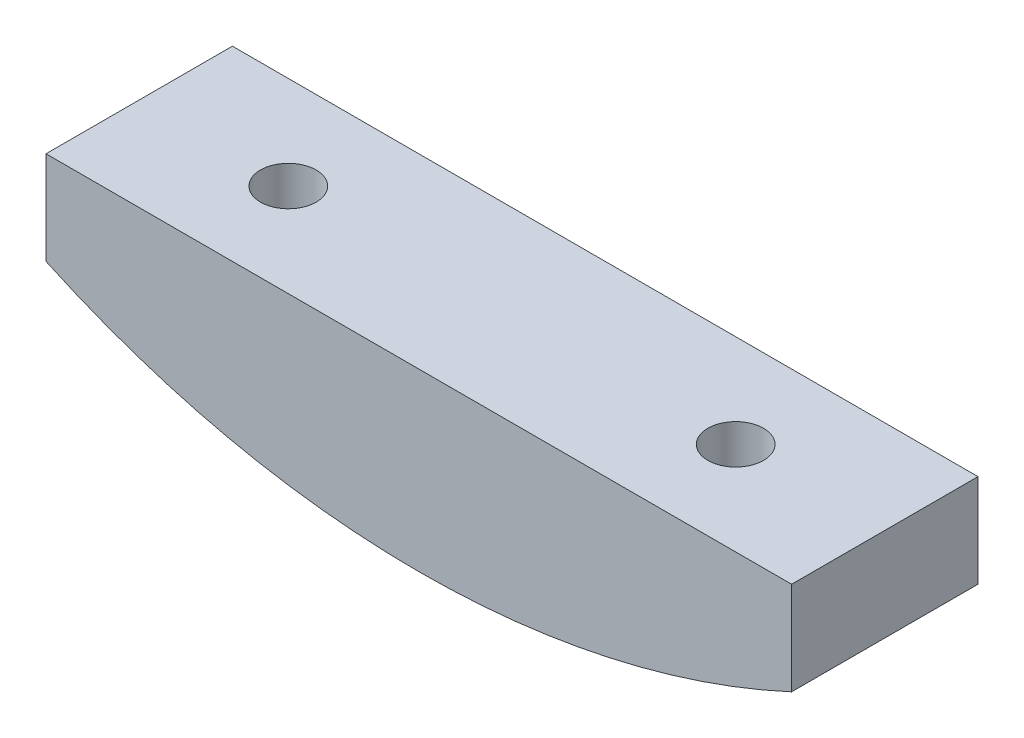
ISO-10303-21;
HEADER;
FILE_DESCRIPTION(('STEP AP214'),'2;1');
FILE_NAME('part.step','',(''),(''),'','','');
FILE_SCHEMA(('AUTOMOTIVE_DESIGN { 1 0 10303 214 1 1 1 1 }'));
ENDSEC;
DATA;
#1=APPLICATION_CONTEXT('core data for automotive mechanical design processes');
#2=APPLICATION_PROTOCOL_DEFINITION('international standard','automotive_design',2000,#1);
#3=PRODUCT_CONTEXT('',#1,'mechanical');
#4=PRODUCT('Part','Part','',(#3));
#5=PRODUCT_RELATED_PRODUCT_CATEGORY('part','',(#4));
#6=PRODUCT_DEFINITION_FORMATION('','',#4);
#7=PRODUCT_DEFINITION_CONTEXT('part definition',#1,'design');
#8=PRODUCT_DEFINITION('design','',#6,#7);
#9=PRODUCT_DEFINITION_SHAPE('','',#8);
#10=(LENGTH_UNIT() NAMED_UNIT(*) SI_UNIT(.MILLI.,.METRE.));
#11=(NAMED_UNIT(*) PLANE_ANGLE_UNIT() SI_UNIT($,.RADIAN.));
#12=(NAMED_UNIT(*) SI_UNIT($,.STERADIAN.) SOLID_ANGLE_UNIT());
#13=UNCERTAINTY_MEASURE_WITH_UNIT(LENGTH_MEASURE(1.E-05),#10,'distance_accuracy_value','');
#14=(GEOMETRIC_REPRESENTATION_CONTEXT(3) GLOBAL_UNCERTAINTY_ASSIGNED_CONTEXT((#13)) GLOBAL_UNIT_ASSIGNED_CONTEXT((#10,
#11,#12)) REPRESENTATION_CONTEXT('',''));
#15=CARTESIAN_POINT('',(0.,0.,0.));
#16=DIRECTION('',(0.,0.,1.));
#17=DIRECTION('',(1.,0.,0.));
#18=AXIS2_PLACEMENT_3D('',#15,#16,#17);
#19=CARTESIAN_POINT('',(25.4,6.35,22.225));
#20=DIRECTION('',(-1.,0.,0.));
#21=DIRECTION('',(0.,0.,1.));
#22=AXIS2_PLACEMENT_3D('',#19,#20,#21);
#23=PLANE('',#22);
#24=DIRECTION('',(0.,0.,-1.));
#25=VECTOR('',#24,1.);
#26=CARTESIAN_POINT('',(25.4,6.35,22.225));
#27=LINE('',#26,#25);
#28=CARTESIAN_POINT('',(25.4,6.35,-22.225));
#29=VERTEX_POINT('',#28);
#30=CARTESIAN_POINT('',(25.4,6.35,-34.925));
#31=VERTEX_POINT('',#30);
#32=EDGE_CURVE('E59',#29,#31,#27,.T.);
#33=ORIENTED_EDGE('',*,*,#32,.F.);
#34=DIRECTION('',(0.,1.,0.));
#35=VECTOR('',#34,1.);
#36=CARTESIAN_POINT('',(25.4,-19.05,-22.225));
#37=LINE('',#36,#35);
#38=CARTESIAN_POINT('',(25.4,0.,-22.225));
#39=VERTEX_POINT('',#38);
#40=EDGE_CURVE('E77',#39,#29,#37,.T.);
#41=ORIENTED_EDGE('',*,*,#40,.F.);
#42=DIRECTION('',(0.,0.,-1.));
#43=VECTOR('',#42,1.);
#44=CARTESIAN_POINT('',(25.4,0.,22.225));
#45=LINE('',#44,#43);
#46=CARTESIAN_POINT('',(25.4,0.,-34.925));
#47=VERTEX_POINT('',#46);
#48=EDGE_CURVE('E93',#39,#47,#45,.T.);
#49=ORIENTED_EDGE('',*,*,#48,.T.);
#50=DIRECTION('',(0.,-1.,0.));
#51=VECTOR('',#50,1.);
#52=CARTESIAN_POINT('',(25.4,6.35,-34.925));
#53=LINE('',#52,#51);
#54=EDGE_CURVE('E88',#31,#47,#53,.T.);
#55=ORIENTED_EDGE('',*,*,#54,.F.);
#56=EDGE_LOOP('',(#33,#41,#49,#55));
#57=FACE_BOUND('',#56,.T.);
#58=ADVANCED_FACE('F38',(#57),#23,.F.);
#59=CARTESIAN_POINT('',(-25.4,6.35,22.225));
#60=DIRECTION('',(1.,0.,0.));
#61=DIRECTION('',(0.,0.,-1.));
#62=AXIS2_PLACEMENT_3D('',#59,#60,#61);
#63=PLANE('',#62);
#64=DIRECTION('',(0.,0.,1.));
#65=VECTOR('',#64,1.);
#66=CARTESIAN_POINT('',(-25.4,0.,22.225));
#67=LINE('',#66,#65);
#68=CARTESIAN_POINT('',(-25.4,0.,-34.925));
#69=VERTEX_POINT('',#68);
#70=CARTESIAN_POINT('',(-25.4,0.,-22.225));
#71=VERTEX_POINT('',#70);
#72=EDGE_CURVE('E89',#69,#71,#67,.T.);
#73=ORIENTED_EDGE('',*,*,#72,.T.);
#74=DIRECTION('',(0.,1.,0.));
#75=VECTOR('',#74,1.);
#76=CARTESIAN_POINT('',(-25.4,-19.05,-22.225));
#77=LINE('',#76,#75);
#78=CARTESIAN_POINT('',(-25.4,6.35,-22.225));
#79=VERTEX_POINT('',#78);
#80=EDGE_CURVE('E51',#71,#79,#77,.T.);
#81=ORIENTED_EDGE('',*,*,#80,.T.);
#82=DIRECTION('',(0.,0.,1.));
#83=VECTOR('',#82,1.);
#84=CARTESIAN_POINT('',(-25.4,6.35,22.225));
#85=LINE('',#84,#83);
#86=CARTESIAN_POINT('',(-25.4,6.35,-34.925));
#87=VERTEX_POINT('',#86);
#88=EDGE_CURVE('E45',#87,#79,#85,.T.);
#89=ORIENTED_EDGE('',*,*,#88,.F.);
#90=DIRECTION('',(0.,1.,0.));
#91=VECTOR('',#90,1.);
#92=CARTESIAN_POINT('',(-25.4,6.35,-34.925));
#93=LINE('',#92,#91);
#94=EDGE_CURVE('E143',#69,#87,#93,.T.);
#95=ORIENTED_EDGE('',*,*,#94,.F.);
#96=EDGE_LOOP('',(#73,#81,#89,#95));
#97=FACE_BOUND('',#96,.T.);
#98=ADVANCED_FACE('F132',(#97),#63,.F.);
#99=CARTESIAN_POINT('',(0.,6.35,0.));
#100=DIRECTION('',(0.,-1.,0.));
#101=DIRECTION('',(0.,0.,-1.));
#102=AXIS2_PLACEMENT_3D('',#99,#100,#101);
#103=PLANE('',#102);
#104=CARTESIAN_POINT('',(-15.24,6.35,-28.575));
#105=DIRECTION('',(0.,1.,0.));
#106=DIRECTION('',(0.,0.,1.));
#107=AXIS2_PLACEMENT_3D('',#104,#105,#106);
#108=CIRCLE('',#107,1.89865);
#109=CARTESIAN_POINT('',(-15.24,6.35,-26.67635));
#110=VERTEX_POINT('',#109);
#111=EDGE_CURVE('E153',#110,#110,#108,.T.);
#112=ORIENTED_EDGE('',*,*,#111,.F.);
#113=EDGE_LOOP('',(#112));
#114=FACE_BOUND('',#113,.T.);
#115=CARTESIAN_POINT('',(15.24,6.35,-28.575));
#116=DIRECTION('',(0.,1.,0.));
#117=DIRECTION('',(0.,0.,1.));
#118=AXIS2_PLACEMENT_3D('',#115,#116,#117);
#119=CIRCLE('',#118,1.89865);
#120=CARTESIAN_POINT('',(15.24,6.35,-26.67635));
#121=VERTEX_POINT('',#120);
#122=EDGE_CURVE('E107',#121,#121,#119,.T.);
#123=ORIENTED_EDGE('',*,*,#122,.F.);
#124=EDGE_LOOP('',(#123));
#125=FACE_BOUND('',#124,.T.);
#126=ORIENTED_EDGE('',*,*,#88,.T.);
#127=DIRECTION('',(-1.,0.,0.));
#128=VECTOR('',#127,1.);
#129=CARTESIAN_POINT('',(-25.4,6.35,-22.225));
#130=LINE('',#129,#128);
#131=EDGE_CURVE('E79',#29,#79,#130,.T.);
#132=ORIENTED_EDGE('',*,*,#131,.F.);
#133=ORIENTED_EDGE('',*,*,#32,.T.);
#134=DIRECTION('',(1.,0.,0.));
#135=VECTOR('',#134,1.);
#136=CARTESIAN_POINT('',(25.4,6.35,-34.925));
#137=LINE('',#136,#135);
#138=EDGE_CURVE('E96',#87,#31,#137,.T.);
#139=ORIENTED_EDGE('',*,*,#138,.F.);
#140=EDGE_LOOP('',(#126,#132,#133,#139));
#141=FACE_BOUND('',#140,.T.);
#142=ADVANCED_FACE('F84',(#114,#125,#141),#103,.F.);
#143=CARTESIAN_POINT('',(0.,54.7169592082747,-22.225));
#144=DIRECTION('',(0.,0.,1.));
#145=DIRECTION('',(1.,0.,0.));
#146=AXIS2_PLACEMENT_3D('',#143,#144,#145);
#147=CYLINDRICAL_SURFACE('',#146,60.325);
#148=CARTESIAN_POINT('',(0.,54.7169592082747,-22.225));
#149=DIRECTION('',(0.,0.,-1.));
#150=DIRECTION('',(-1.,0.,0.));
#151=AXIS2_PLACEMENT_3D('',#148,#149,#150);
#152=CIRCLE('',#151,60.325);
#153=EDGE_CURVE('E11',#71,#39,#152,.F.);
#154=ORIENTED_EDGE('',*,*,#153,.F.);
#155=ORIENTED_EDGE('',*,*,#72,.F.);
#156=CARTESIAN_POINT('',(0.,54.716959208275,-34.925));
#157=DIRECTION('',(0.,0.,-1.));
#158=DIRECTION('',(-1.,0.,0.));
#159=AXIS2_PLACEMENT_3D('',#156,#157,#158);
#160=CIRCLE('',#159,60.3250000000002);
#161=EDGE_CURVE('E147',#47,#69,#160,.T.);
#162=ORIENTED_EDGE('',*,*,#161,.F.);
#163=ORIENTED_EDGE('',*,*,#48,.F.);
#164=EDGE_LOOP('',(#154,#155,#162,#163));
#165=FACE_BOUND('',#164,.T.);
#166=CARTESIAN_POINT('',(-15.24,-3.65125153181907,-26.67635));
#167=CARTESIAN_POINT('',(-15.3499184930942,-3.62255121740163,-26.6763545113177));
#168=CARTESIAN_POINT('',(-15.4598378869662,-3.59351642381804,-26.685922535707));
#169=CARTESIAN_POINT('',(-15.6765270276332,-3.53563512608759,-26.7239340920509));
#170=CARTESIAN_POINT('',(-15.7832924337515,-3.50678892042761,-26.7524024770733));
#171=CARTESIAN_POINT('',(-15.9905560351687,-3.45020748662141,-26.827521413129));
#172=CARTESIAN_POINT('',(-16.0910543698034,-3.42247223378028,-26.87417155976));
#173=CARTESIAN_POINT('',(-16.282798843519,-3.36906322322865,-26.984505408716));
#174=CARTESIAN_POINT('',(-16.3740479023494,-3.34338881550032,-27.0481837124682));
#175=CARTESIAN_POINT('',(-16.5434396117115,-3.2953489648248,-27.1900910577018));
#176=CARTESIAN_POINT('',(-16.6217301709341,-3.27294658143279,-27.2681307415289));
#177=CARTESIAN_POINT('',(-16.7639808400153,-3.23198440249719,-27.4372157425545));
#178=CARTESIAN_POINT('',(-16.8279431406719,-3.2134240195428,-27.5282590679987));
#179=CARTESIAN_POINT('',(-16.9373013555109,-3.18154328430757,-27.7173588736946));
#180=CARTESIAN_POINT('',(-16.9832710292298,-3.16806162695819,-27.8150561858391));
#181=CARTESIAN_POINT('',(-17.0580986158113,-3.14605515671618,-28.0173196092432));
#182=CARTESIAN_POINT('',(-17.086960902088,-3.13752907696689,-28.1218839573816));
#183=CARTESIAN_POINT('',(-17.1257478867714,-3.12605921153134,-28.3307004885478));
#184=CARTESIAN_POINT('',(-17.1363401370802,-3.12291867491036,-28.4348182393466));
#185=CARTESIAN_POINT('',(-17.1402813737572,-3.1217508919649,-28.6434015793989));
#186=CARTESIAN_POINT('',(-17.1336326555475,-3.12372296495956,-28.747867120499));
#187=CARTESIAN_POINT('',(-17.1036087041682,-3.13260801068522,-28.9522491583515));
#188=CARTESIAN_POINT('',(-17.0805305838055,-3.13943321578035,-29.0522133931449));
#189=CARTESIAN_POINT('',(-17.0187730717253,-3.15762948434195,-29.246754987258));
#190=CARTESIAN_POINT('',(-16.980093170916,-3.16900069614614,-29.3413321706813));
#191=CARTESIAN_POINT('',(-16.8878530977008,-3.1959786178084,-29.5236922720175));
#192=CARTESIAN_POINT('',(-16.8341220681463,-3.21163390946154,-29.611381424647));
#193=CARTESIAN_POINT('',(-16.7136617045635,-3.24650393301168,-29.776517146618));
#194=CARTESIAN_POINT('',(-16.6469304372701,-3.26571919429083,-29.8539621896788));
#195=CARTESIAN_POINT('',(-16.4999630738011,-3.30771541492525,-29.9992170280251));
#196=CARTESIAN_POINT('',(-16.4193481321339,-3.33059459441194,-30.0666149549995));
#197=CARTESIAN_POINT('',(-16.2485959897706,-3.37862250228589,-30.1869938817415));
#198=CARTESIAN_POINT('',(-16.158456978295,-3.40377166212394,-30.2399721330729));
#199=CARTESIAN_POINT('',(-15.9675710430354,-3.45650941386007,-30.332029309812));
#200=CARTESIAN_POINT('',(-15.8665539251303,-3.48415399642388,-30.3705164107702));
#201=CARTESIAN_POINT('',(-15.6596464918627,-3.54016554067237,-30.4298194612576));
#202=CARTESIAN_POINT('',(-15.5537554697202,-3.56853260685855,-30.4506328393002));
#203=CARTESIAN_POINT('',(-15.3374935613802,-3.62581844538718,-30.474333049042));
#204=CARTESIAN_POINT('',(-15.2270756157357,-3.65473497758844,-30.476798492568));
#205=CARTESIAN_POINT('',(-15.0072355743318,-3.71164166911266,-30.4625450256052));
#206=CARTESIAN_POINT('',(-14.8978135099391,-3.73963179932995,-30.4458255129513));
#207=CARTESIAN_POINT('',(-14.683166098556,-3.79391596767155,-30.3935171965208));
#208=CARTESIAN_POINT('',(-14.5779393687393,-3.82021056645477,-30.357934666412));
#209=CARTESIAN_POINT('',(-14.3748238018961,-3.87042012941077,-30.2687066665023));
#210=CARTESIAN_POINT('',(-14.2769342858411,-3.89433531385564,-30.2150628707258));
#211=CARTESIAN_POINT('',(-14.0934484590909,-3.93872323182554,-30.0923106028181));
#212=CARTESIAN_POINT('',(-14.0076456554723,-3.95925518439088,-30.0235324291632));
#213=CARTESIAN_POINT('',(-13.8488258070358,-3.99694309406082,-29.8717517646284));
#214=CARTESIAN_POINT('',(-13.7758067563339,-4.01409958085824,-29.7887515093704));
#215=CARTESIAN_POINT('',(-13.6468453432596,-4.04419729554016,-29.6133853737787));
#216=CARTESIAN_POINT('',(-13.5904816627359,-4.05724320468738,-29.5213472541357));
#217=CARTESIAN_POINT('',(-13.4940216855315,-4.07946472052835,-29.3286791513966));
#218=CARTESIAN_POINT('',(-13.4539229738446,-4.08864090180344,-29.2280504465096));
#219=CARTESIAN_POINT('',(-13.3921175855784,-4.10274666023215,-29.0236903562394));
#220=CARTESIAN_POINT('',(-13.3699888898862,-4.10777372725124,-28.9200931892576));
#221=CARTESIAN_POINT('',(-13.3432526438794,-4.11384417635214,-28.7105500750733));
#222=CARTESIAN_POINT('',(-13.3386435179878,-4.11488791666411,-28.6046043399452));
#223=CARTESIAN_POINT('',(-13.3470423843931,-4.11298299538166,-28.3948312459954));
#224=CARTESIAN_POINT('',(-13.3598230169881,-4.11008585831067,-28.2909942212428));
#225=CARTESIAN_POINT('',(-13.402182154837,-4.10044981967865,-28.0869942842351));
#226=CARTESIAN_POINT('',(-13.4317604065591,-4.0937109761017,-27.9868313165507));
#227=CARTESIAN_POINT('',(-13.5068073396524,-4.0765204820947,-27.7928603612549));
#228=CARTESIAN_POINT('',(-13.5522943502034,-4.06606454881258,-27.6990598535894));
#229=CARTESIAN_POINT('',(-13.6577194336805,-4.0416592296474,-27.5204797255628));
#230=CARTESIAN_POINT('',(-13.7176576778215,-4.02770980237416,-27.4357002120975));
#231=CARTESIAN_POINT('',(-13.8511303223357,-3.99638312473986,-27.2761992494575));
#232=CARTESIAN_POINT('',(-13.9248496429395,-3.97895900744014,-27.2016418662364));
#233=CARTESIAN_POINT('',(-14.0831038588329,-3.94118957258101,-27.0659158701644));
#234=CARTESIAN_POINT('',(-14.1676425778143,-3.92084322196069,-27.0047520115472));
#235=CARTESIAN_POINT('',(-14.3473174381009,-3.8771434051675,-26.8959231265721));
#236=CARTESIAN_POINT('',(-14.4426658516387,-3.85372742341771,-26.8486342492432));
#237=CARTESIAN_POINT('',(-14.6393734282308,-3.80487096359943,-26.7707577093477));
#238=CARTESIAN_POINT('',(-14.7407264008117,-3.7794325616237,-26.7401531669651));
#239=CARTESIAN_POINT('',(-14.9088768533609,-3.73674527262268,-26.7042556003777));
#240=CARTESIAN_POINT('',(-14.9747238772741,-3.71991215722247,-26.6937966972037));
#241=CARTESIAN_POINT('',(-15.1070471526565,-3.6858439880097,-26.6798424914572));
#242=CARTESIAN_POINT('',(-15.1735234115941,-3.66860892942288,-26.6763472716419));
#243=CARTESIAN_POINT('',(-15.24,-3.65125153181907,-26.67635));
#244=B_SPLINE_CURVE_WITH_KNOTS('',3,(#166,#167,#168,#169,#170,#171,#172,#173,#174,#175,#176,
#177,#178,#179,#180,#181,#182,#183,#184,#185,#186,#187,#188,#189,#190,#191,#192,#193,#194,#195,
#196,#197,#198,#199,#200,#201,#202,#203,#204,#205,#206,#207,#208,#209,#210,#211,#212,#213,#214,
#215,#216,#217,#218,#219,#220,#221,#222,#223,#224,#225,#226,#227,#228,#229,#230,#231,#232,#233,
#234,#235,#236,#237,#238,#239,#240,#241,#242,#243),.UNSPECIFIED.,.T.,.F.,(4,2,2,2,2,2,2,2,2,2,2,
2,2,2,2,2,2,2,2,2,2,2,2,2,2,2,2,2,2,2,2,2,2,2,2,2,2,2,4),(0.,0.340561745097224,
0.681572201879029,1.02257507427187,1.36346996371165,1.70015599226363,2.0367905061614,
2.3615880598947,2.68630254498021,2.9988793358936,3.31141451320271,3.6184367873432,
3.92546908054182,4.23613877101429,4.5468546964841,4.86802515512746,5.18925678708514,
5.52246444701298,5.85572057959724,6.19660749244846,6.5375051051307,6.87828940943913,
7.21904213654345,7.5529885667709,7.88688255079503,8.21141675990214,8.53590276484257,
8.85252801708287,9.16912479378023,9.48162180536494,9.79411410046007,10.1069676241999,
10.419824854737,10.7372284892819,11.054744609056,11.3802072762103,11.7053400534542,
11.9113027925188,12.1172679792524),.UNSPECIFIED.);
#245=CARTESIAN_POINT('',(-15.24,-3.65125153181907,-26.67635));
#246=VERTEX_POINT('',#245);
#247=EDGE_CURVE('E108',#246,#246,#244,.T.);
#248=ORIENTED_EDGE('',*,*,#247,.F.);
#249=EDGE_LOOP('',(#248));
#250=FACE_BOUND('',#249,.T.);
#251=CARTESIAN_POINT('',(15.24,-3.65125153181907,-26.67635));
#252=CARTESIAN_POINT('',(15.1312385833126,-3.67964880023889,-26.6763543233393));
#253=CARTESIAN_POINT('',(15.0223218871229,-3.70775940686544,-26.6857212026046));
#254=CARTESIAN_POINT('',(14.8072816124641,-3.76263028851808,-26.723092926586));
#255=CARTESIAN_POINT('',(14.7011613042465,-3.78938901342849,-26.7511186667716));
#256=CARTESIAN_POINT('',(14.4948243213073,-3.84084986573122,-26.8252565105653));
#257=CARTESIAN_POINT('',(14.3946103720577,-3.86555104581513,-26.8713768898854));
#258=CARTESIAN_POINT('',(14.2032338768104,-3.91224413448862,-26.9805968791029));
#259=CARTESIAN_POINT('',(14.1120685047403,-3.9342368894997,-27.0436911646825));
#260=CARTESIAN_POINT('',(13.9432533986336,-3.97459655745112,-27.1839078416339));
#261=CARTESIAN_POINT('',(13.8653857047923,-3.99302277799839,-27.2607505341474));
#262=CARTESIAN_POINT('',(13.7236947908552,-4.0263054077567,-27.4271219893699));
#263=CARTESIAN_POINT('',(13.6598699645098,-4.04116222526067,-27.5166492992606));
#264=CARTESIAN_POINT('',(13.5499907555409,-4.0665969936867,-27.703147179062));
#265=CARTESIAN_POINT('',(13.5034898529314,-4.07728285898448,-27.7998400370964));
#266=CARTESIAN_POINT('',(13.4273536010991,-4.09471766935665,-27.9999840101545));
#267=CARTESIAN_POINT('',(13.3977159223239,-4.10146715822085,-28.1034341894929));
#268=CARTESIAN_POINT('',(13.3567552479009,-4.11078211655447,-28.3117682824599));
#269=CARTESIAN_POINT('',(13.3450534750294,-4.11343412807283,-28.4165739950623));
#270=CARTESIAN_POINT('',(13.339146651127,-4.11477374778958,-28.6266992134553));
#271=CARTESIAN_POINT('',(13.3449403483978,-4.11346163959745,-28.7320186819516));
#272=CARTESIAN_POINT('',(13.3737008500909,-4.10693016079327,-28.9391992205087));
#273=CARTESIAN_POINT('',(13.3965145325389,-4.10174562834241,-29.0410827116688));
#274=CARTESIAN_POINT('',(13.4583984444222,-4.08761659724321,-29.2395062345891));
#275=CARTESIAN_POINT('',(13.4974687446735,-4.07867208221586,-29.3360462430701));
#276=CARTESIAN_POINT('',(13.5908788563969,-4.05715018389091,-29.5216368665879));
#277=CARTESIAN_POINT('',(13.645298939142,-4.04455369276618,-29.6106448235888));
#278=CARTESIAN_POINT('',(13.7676319211652,-4.01601168314853,-29.7782330611382));
#279=CARTESIAN_POINT('',(13.8355457854167,-4.00006592513665,-29.8568125952538));
#280=CARTESIAN_POINT('',(13.9841766240825,-3.96484677016659,-30.0028762976621));
#281=CARTESIAN_POINT('',(14.0651030363879,-3.94551837999891,-30.0701339626096));
#282=CARTESIAN_POINT('',(14.2364543004356,-3.90416969776546,-30.1901513706483));
#283=CARTESIAN_POINT('',(14.3268803262581,-3.88214907290468,-30.2429093187637));
#284=CARTESIAN_POINT('',(14.5171646523791,-3.8353028612473,-30.3339180594446));
#285=CARTESIAN_POINT('',(14.6172085164814,-3.81041872068953,-30.3717506672849));
#286=CARTESIAN_POINT('',(14.8218075050329,-3.75893989244836,-30.4300762245403));
#287=CARTESIAN_POINT('',(14.9263632807077,-3.73234495756424,-30.4505666620203));
#288=CARTESIAN_POINT('',(15.1399341713472,-3.67739398586375,-30.4741313596064));
#289=CARTESIAN_POINT('',(15.248994277625,-3.6490100383227,-30.4767339517185));
#290=CARTESIAN_POINT('',(15.4658789243533,-3.59191486701928,-30.4632953185815));
#291=CARTESIAN_POINT('',(15.5737033202017,-3.56320360572341,-30.4472519334399));
#292=CARTESIAN_POINT('',(15.7867366955687,-3.50586207986232,-30.3965692899146));
#293=CARTESIAN_POINT('',(15.8918829487442,-3.47723936718875,-30.3616570791917));
#294=CARTESIAN_POINT('',(16.0948427248985,-3.42143386916349,-30.273922504518));
#295=CARTESIAN_POINT('',(16.1926561666971,-3.39425109975411,-30.2210999423209));
#296=CARTESIAN_POINT('',(16.3773807420378,-3.34246014552538,-30.099268112683));
#297=CARTESIAN_POINT('',(16.4643623262087,-3.31783551750641,-30.0303728387607));
#298=CARTESIAN_POINT('',(16.6254463900072,-3.27189477226397,-29.8779574091597));
#299=CARTESIAN_POINT('',(16.6995508877348,-3.25057813666726,-29.7944395492623));
#300=CARTESIAN_POINT('',(16.8303572523949,-3.21273276389781,-29.6177626299995));
#301=CARTESIAN_POINT('',(16.8875136390544,-3.19607980905348,-29.5249669950459));
#302=CARTESIAN_POINT('',(16.9853126185505,-3.16747213251904,-29.3303826113384));
#303=CARTESIAN_POINT('',(17.0259594800861,-3.15551619639505,-29.2285961955361));
#304=CARTESIAN_POINT('',(17.0879772726149,-3.13723396600849,-29.0232246226045));
#305=CARTESIAN_POINT('',(17.110041980146,-3.13070518103746,-28.9198667620178));
#306=CARTESIAN_POINT('',(17.1367217928008,-3.12280731483531,-28.7107349137297));
#307=CARTESIAN_POINT('',(17.1413400527754,-3.12143730074087,-28.604961366339));
#308=CARTESIAN_POINT('',(17.1330713929043,-3.12388710677276,-28.3969292578424));
#309=CARTESIAN_POINT('',(17.1206362120445,-3.12757299849671,-28.2946507785609));
#310=CARTESIAN_POINT('',(17.0794996934802,-3.13973245085439,-28.0937219277832));
#311=CARTESIAN_POINT('',(17.0507986119693,-3.14820593608185,-27.9950714991698));
#312=CARTESIAN_POINT('',(16.9780244719842,-3.16960003832685,-27.8038762910594));
#313=CARTESIAN_POINT('',(16.9339157277907,-3.18253097834136,-27.7113462839856));
#314=CARTESIAN_POINT('',(16.8317674691525,-3.21230842568598,-27.5350326350523));
#315=CARTESIAN_POINT('',(16.7737268640483,-3.22915523956808,-27.4512496786954));
#316=CARTESIAN_POINT('',(16.6436481256629,-3.26665312542194,-27.2922334242877));
#317=CARTESIAN_POINT('',(16.57126197072,-3.2873979331861,-27.2173071707427));
#318=CARTESIAN_POINT('',(16.4157046376851,-3.33161353128338,-27.0805698097049));
#319=CARTESIAN_POINT('',(16.3325289017271,-3.35508547320604,-27.0187642740826));
#320=CARTESIAN_POINT('',(16.1542891395615,-3.40492523442398,-26.9075445576447));
#321=CARTESIAN_POINT('',(16.0588892660117,-3.43137003816182,-26.8587035666801));
#322=CARTESIAN_POINT('',(15.8616277460393,-3.48548762240572,-26.7778368771489));
#323=CARTESIAN_POINT('',(15.7597724173739,-3.51315919457611,-26.7457950141456));
#324=CARTESIAN_POINT('',(15.5878361960701,-3.55936536836379,-26.7071718223238));
#325=CARTESIAN_POINT('',(15.5187985849741,-3.57778908044715,-26.6956310412106));
#326=CARTESIAN_POINT('',(15.3798620804679,-3.6145985796434,-26.6802186521319));
#327=CARTESIAN_POINT('',(15.3099631674689,-3.63298436588259,-26.6763472189171));
#328=CARTESIAN_POINT('',(15.24,-3.65125153181907,-26.67635));
#329=B_SPLINE_CURVE_WITH_KNOTS('',3,(#251,#252,#253,#254,#255,#256,#257,#258,#259,#260,#261,
#262,#263,#264,#265,#266,#267,#268,#269,#270,#271,#272,#273,#274,#275,#276,#277,#278,#279,#280,
#281,#282,#283,#284,#285,#286,#287,#288,#289,#290,#291,#292,#293,#294,#295,#296,#297,#298,#299,
#300,#301,#302,#303,#304,#305,#306,#307,#308,#309,#310,#311,#312,#313,#314,#315,#316,#317,#318,
#319,#320,#321,#322,#323,#324,#325,#326,#327,#328),.UNSPECIFIED.,.T.,.F.,(4,2,2,2,2,2,2,2,2,2,2,
2,2,2,2,2,2,2,2,2,2,2,2,2,2,2,2,2,2,2,2,2,2,2,2,2,2,2,4),(0.,0.336964708368183,
0.674307409040916,1.01180457599157,1.34919600115279,1.6803748739651,2.01151584619923,
2.3334085108677,2.65525669720893,2.97020947989584,3.28513973009353,3.59727033853255,
3.90940230666983,4.22319782729392,4.53701579628918,4.8565123797891,5.17604849720343,
5.50399126897414,5.83198153364674,6.16858817882405,6.50523381936776,6.84688499352515,
7.18853994947662,7.52784172040656,7.86709026783207,8.19618400319364,8.52519259390334,
8.84129137531192,9.1573329936614,9.46516254090816,9.77298723986661,10.0815296719292,
10.3900962662031,10.7073485478234,11.0247352861172,11.35442482394,11.6837965433637,
11.900551546065,12.1173114876022),.UNSPECIFIED.);
#330=CARTESIAN_POINT('',(15.24,-3.65125153181907,-26.67635));
#331=VERTEX_POINT('',#330);
#332=EDGE_CURVE('E100',#331,#331,#329,.T.);
#333=ORIENTED_EDGE('',*,*,#332,.F.);
#334=EDGE_LOOP('',(#333));
#335=FACE_BOUND('',#334,.T.);
#336=ADVANCED_FACE('F113',(#165,#250,#335),#147,.T.);
#337=CARTESIAN_POINT('',(0.,54.716959208275,-34.925));
#338=DIRECTION('',(0.,0.,-1.));
#339=DIRECTION('',(-1.,0.,0.));
#340=AXIS2_PLACEMENT_3D('',#337,#338,#339);
#341=PLANE('',#340);
#342=ORIENTED_EDGE('',*,*,#54,.T.);
#343=ORIENTED_EDGE('',*,*,#161,.T.);
#344=ORIENTED_EDGE('',*,*,#94,.T.);
#345=ORIENTED_EDGE('',*,*,#138,.T.);
#346=EDGE_LOOP('',(#342,#343,#344,#345));
#347=FACE_BOUND('',#346,.T.);
#348=ADVANCED_FACE('F121',(#347),#341,.T.);
#349=CARTESIAN_POINT('',(15.24,6.35,-28.575));
#350=DIRECTION('',(0.,1.,0.));
#351=DIRECTION('',(0.,0.,1.));
#352=AXIS2_PLACEMENT_3D('',#349,#350,#351);
#353=CYLINDRICAL_SURFACE('',#352,1.89865);
#354=ORIENTED_EDGE('',*,*,#332,.T.);
#355=EDGE_LOOP('',(#354));
#356=FACE_BOUND('',#355,.T.);
#357=ORIENTED_EDGE('',*,*,#122,.T.);
#358=EDGE_LOOP('',(#357));
#359=FACE_BOUND('',#358,.T.);
#360=ADVANCED_FACE('F117',(#356,#359),#353,.F.);
#361=CARTESIAN_POINT('',(-15.24,6.35,-28.575));
#362=DIRECTION('',(0.,1.,0.));
#363=DIRECTION('',(0.,0.,1.));
#364=AXIS2_PLACEMENT_3D('',#361,#362,#363);
#365=CYLINDRICAL_SURFACE('',#364,1.89865);
#366=ORIENTED_EDGE('',*,*,#247,.T.);
#367=EDGE_LOOP('',(#366));
#368=FACE_BOUND('',#367,.T.);
#369=ORIENTED_EDGE('',*,*,#111,.T.);
#370=EDGE_LOOP('',(#369));
#371=FACE_BOUND('',#370,.T.);
#372=ADVANCED_FACE('F120',(#368,#371),#365,.F.);
#373=CARTESIAN_POINT('',(-25.4,-19.05,-22.225));
#374=DIRECTION('',(0.,0.,-1.));
#375=DIRECTION('',(-1.,0.,0.));
#376=AXIS2_PLACEMENT_3D('',#373,#374,#375);
#377=PLANE('',#376);
#378=ORIENTED_EDGE('',*,*,#153,.T.);
#379=ORIENTED_EDGE('',*,*,#40,.T.);
#380=ORIENTED_EDGE('',*,*,#131,.T.);
#381=ORIENTED_EDGE('',*,*,#80,.F.);
#382=EDGE_LOOP('',(#378,#379,#380,#381));
#383=FACE_BOUND('',#382,.T.);
#384=ADVANCED_FACE('F78',(#383),#377,.F.);
#385=CLOSED_SHELL('',(#58,#98,#142,#336,#348,#360,#372,#384));
#386=MANIFOLD_SOLID_BREP('B2',#385);
#387=ADVANCED_BREP_SHAPE_REPRESENTATION('',(#18,#386),#14);
#388=SHAPE_DEFINITION_REPRESENTATION(#9,#387);
ENDSEC;
END-ISO-10303-21;
